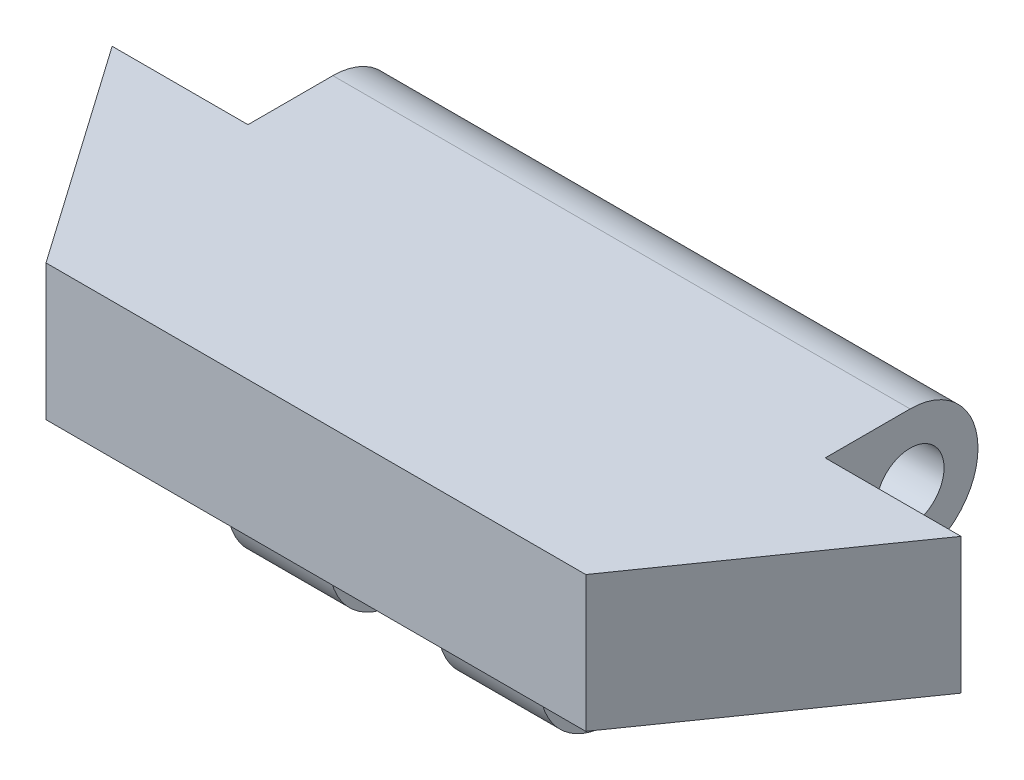
ISO-10303-21;
HEADER;
FILE_DESCRIPTION(('STEP AP214'),'2;1');
FILE_NAME('part.step','',(''),(''),'','','');
FILE_SCHEMA(('AUTOMOTIVE_DESIGN { 1 0 10303 214 1 1 1 1 }'));
ENDSEC;
DATA;
#1=APPLICATION_CONTEXT('core data for automotive mechanical design processes');
#2=APPLICATION_PROTOCOL_DEFINITION('international standard','automotive_design',2000,#1);
#3=PRODUCT_CONTEXT('',#1,'mechanical');
#4=PRODUCT('Part','Part','',(#3));
#5=PRODUCT_RELATED_PRODUCT_CATEGORY('part','',(#4));
#6=PRODUCT_DEFINITION_FORMATION('','',#4);
#7=PRODUCT_DEFINITION_CONTEXT('part definition',#1,'design');
#8=PRODUCT_DEFINITION('design','',#6,#7);
#9=PRODUCT_DEFINITION_SHAPE('','',#8);
#10=(LENGTH_UNIT() NAMED_UNIT(*) SI_UNIT(.MILLI.,.METRE.));
#11=(NAMED_UNIT(*) PLANE_ANGLE_UNIT() SI_UNIT($,.RADIAN.));
#12=(NAMED_UNIT(*) SI_UNIT($,.STERADIAN.) SOLID_ANGLE_UNIT());
#13=UNCERTAINTY_MEASURE_WITH_UNIT(LENGTH_MEASURE(1.E-05),#10,'distance_accuracy_value','');
#14=(GEOMETRIC_REPRESENTATION_CONTEXT(3) GLOBAL_UNCERTAINTY_ASSIGNED_CONTEXT((#13)) GLOBAL_UNIT_ASSIGNED_CONTEXT((#10,
#11,#12)) REPRESENTATION_CONTEXT('',''));
#15=CARTESIAN_POINT('',(0.,0.,0.));
#16=DIRECTION('',(0.,0.,1.));
#17=DIRECTION('',(1.,0.,0.));
#18=AXIS2_PLACEMENT_3D('',#15,#16,#17);
#19=CARTESIAN_POINT('',(0.,0.,0.));
#20=DIRECTION('',(0.,-1.,0.));
#21=DIRECTION('',(0.,0.,-1.));
#22=AXIS2_PLACEMENT_3D('',#19,#20,#21);
#23=PLANE('',#22);
#24=DIRECTION('',(1.,0.,0.));
#25=VECTOR('',#24,1.);
#26=CARTESIAN_POINT('',(7.9,0.,4.5));
#27=LINE('',#26,#25);
#28=CARTESIAN_POINT('',(7.9,0.,4.5));
#29=VERTEX_POINT('',#28);
#30=CARTESIAN_POINT('',(10.9,0.,4.5));
#31=VERTEX_POINT('',#30);
#32=EDGE_CURVE('E239',#29,#31,#27,.T.);
#33=ORIENTED_EDGE('',*,*,#32,.T.);
#34=DIRECTION('',(1.,0.,0.));
#35=VECTOR('',#34,1.);
#36=CARTESIAN_POINT('',(1.88612181134003,0.,4.5));
#37=LINE('',#36,#35);
#38=CARTESIAN_POINT('',(14.1,0.,4.5));
#39=VERTEX_POINT('',#38);
#40=EDGE_CURVE('E168',#31,#39,#37,.T.);
#41=ORIENTED_EDGE('',*,*,#40,.T.);
#42=CARTESIAN_POINT('',(17.1,0.,4.5));
#43=VERTEX_POINT('',#42);
#44=EDGE_CURVE('E243',#39,#43,#27,.T.);
#45=ORIENTED_EDGE('',*,*,#44,.T.);
#46=DIRECTION('',(0.,0.,1.));
#47=VECTOR('',#46,1.);
#48=CARTESIAN_POINT('',(17.1,0.,4.5));
#49=LINE('',#48,#47);
#50=CARTESIAN_POINT('',(17.1,0.,0.499999999999997));
#51=VERTEX_POINT('',#50);
#52=EDGE_CURVE('E221',#51,#43,#49,.T.);
#53=ORIENTED_EDGE('',*,*,#52,.F.);
#54=DIRECTION('',(1.,0.,0.));
#55=VECTOR('',#54,1.);
#56=CARTESIAN_POINT('',(7.9,0.,0.499999999999997));
#57=LINE('',#56,#55);
#58=CARTESIAN_POINT('',(14.1,0.,0.5));
#59=VERTEX_POINT('',#58);
#60=EDGE_CURVE('E247',#59,#51,#57,.T.);
#61=ORIENTED_EDGE('',*,*,#60,.F.);
#62=DIRECTION('',(0.,0.,1.));
#63=VECTOR('',#62,1.);
#64=CARTESIAN_POINT('',(14.1,0.,-2.5));
#65=LINE('',#64,#63);
#66=CARTESIAN_POINT('',(14.1,0.,-2.5));
#67=VERTEX_POINT('',#66);
#68=EDGE_CURVE('E186',#67,#59,#65,.T.);
#69=ORIENTED_EDGE('',*,*,#68,.F.);
#70=DIRECTION('',(-1.,0.,0.));
#71=VECTOR('',#70,1.);
#72=CARTESIAN_POINT('',(21.,0.,-2.5));
#73=LINE('',#72,#71);
#74=CARTESIAN_POINT('',(21.,0.,-2.5));
#75=VERTEX_POINT('',#74);
#76=EDGE_CURVE('E284',#75,#67,#73,.T.);
#77=ORIENTED_EDGE('',*,*,#76,.F.);
#78=DIRECTION('',(0.,0.,-1.));
#79=VECTOR('',#78,1.);
#80=CARTESIAN_POINT('',(21.,0.,0.));
#81=LINE('',#80,#79);
#82=CARTESIAN_POINT('',(21.,0.,0.));
#83=VERTEX_POINT('',#82);
#84=EDGE_CURVE('E264',#83,#75,#81,.T.);
#85=ORIENTED_EDGE('',*,*,#84,.F.);
#86=DIRECTION('',(-1.,0.,0.));
#87=VECTOR('',#86,1.);
#88=CARTESIAN_POINT('',(0.,0.,0.));
#89=LINE('',#88,#87);
#90=CARTESIAN_POINT('',(25.,0.,0.));
#91=VERTEX_POINT('',#90);
#92=EDGE_CURVE('E299',#91,#83,#89,.T.);
#93=ORIENTED_EDGE('',*,*,#92,.F.);
#94=DIRECTION('',(0.573576436351046,0.,-0.819152044288992));
#95=VECTOR('',#94,1.);
#96=CARTESIAN_POINT('',(25.,0.,0.));
#97=LINE('',#96,#95);
#98=CARTESIAN_POINT('',(20.4486510016369,0.,6.5));
#99=VERTEX_POINT('',#98);
#100=EDGE_CURVE('E305',#99,#91,#97,.T.);
#101=ORIENTED_EDGE('',*,*,#100,.F.);
#102=DIRECTION('',(1.,0.,0.));
#103=VECTOR('',#102,1.);
#104=CARTESIAN_POINT('',(4.55134899836309,0.,6.5));
#105=LINE('',#104,#103);
#106=CARTESIAN_POINT('',(4.55134899836309,0.,6.5));
#107=VERTEX_POINT('',#106);
#108=EDGE_CURVE('E303',#107,#99,#105,.T.);
#109=ORIENTED_EDGE('',*,*,#108,.F.);
#110=DIRECTION('',(0.573576436351044,0.,0.819152044288993));
#111=VECTOR('',#110,1.);
#112=CARTESIAN_POINT('',(0.,0.,0.));
#113=LINE('',#112,#111);
#114=CARTESIAN_POINT('',(0.,0.,0.));
#115=VERTEX_POINT('',#114);
#116=EDGE_CURVE('E301',#115,#107,#113,.T.);
#117=ORIENTED_EDGE('',*,*,#116,.F.);
#118=CARTESIAN_POINT('',(4.,0.,0.));
#119=VERTEX_POINT('',#118);
#120=EDGE_CURVE('E287',#119,#115,#89,.T.);
#121=ORIENTED_EDGE('',*,*,#120,.F.);
#122=DIRECTION('',(0.,0.,-1.));
#123=VECTOR('',#122,1.);
#124=CARTESIAN_POINT('',(4.,0.,0.));
#125=LINE('',#124,#123);
#126=CARTESIAN_POINT('',(4.,0.,-2.5));
#127=VERTEX_POINT('',#126);
#128=EDGE_CURVE('E274',#119,#127,#125,.T.);
#129=ORIENTED_EDGE('',*,*,#128,.T.);
#130=CARTESIAN_POINT('',(10.9,0.,-2.5));
#131=VERTEX_POINT('',#130);
#132=EDGE_CURVE('E283',#131,#127,#73,.T.);
#133=ORIENTED_EDGE('',*,*,#132,.F.);
#134=DIRECTION('',(0.,0.,1.));
#135=VECTOR('',#134,1.);
#136=CARTESIAN_POINT('',(10.9,0.,-2.5));
#137=LINE('',#136,#135);
#138=CARTESIAN_POINT('',(10.9,0.,0.5));
#139=VERTEX_POINT('',#138);
#140=EDGE_CURVE('E169',#131,#139,#137,.T.);
#141=ORIENTED_EDGE('',*,*,#140,.T.);
#142=CARTESIAN_POINT('',(7.9,0.,0.499999999999997));
#143=VERTEX_POINT('',#142);
#144=EDGE_CURVE('E244',#143,#139,#57,.T.);
#145=ORIENTED_EDGE('',*,*,#144,.F.);
#146=DIRECTION('',(0.,0.,1.));
#147=VECTOR('',#146,1.);
#148=CARTESIAN_POINT('',(7.9,0.,4.5));
#149=LINE('',#148,#147);
#150=EDGE_CURVE('E236',#143,#29,#149,.T.);
#151=ORIENTED_EDGE('',*,*,#150,.T.);
#152=EDGE_LOOP('',(#33,#41,#45,#53,#61,#69,#77,#85,#93,#101,#109,#117,#121,#129,#133,#141,#145,#151));
#153=FACE_BOUND('',#152,.T.);
#154=ADVANCED_FACE('F37',(#153),#23,.T.);
#155=CARTESIAN_POINT('',(7.9,0.,4.5));
#156=DIRECTION('',(0.,0.,1.));
#157=DIRECTION('',(1.,0.,0.));
#158=AXIS2_PLACEMENT_3D('',#155,#156,#157);
#159=PLANE('',#158);
#160=DIRECTION('',(0.,-1.,0.));
#161=VECTOR('',#160,1.);
#162=CARTESIAN_POINT('',(14.1,0.,4.5));
#163=LINE('',#162,#161);
#164=CARTESIAN_POINT('',(14.1,-1.5,4.5));
#165=VERTEX_POINT('',#164);
#166=EDGE_CURVE('E195',#39,#165,#163,.T.);
#167=ORIENTED_EDGE('',*,*,#166,.T.);
#168=DIRECTION('',(1.,0.,0.));
#169=VECTOR('',#168,1.);
#170=CARTESIAN_POINT('',(7.9,-1.5,4.5));
#171=LINE('',#170,#169);
#172=CARTESIAN_POINT('',(17.1,-1.5,4.5));
#173=VERTEX_POINT('',#172);
#174=EDGE_CURVE('E238',#165,#173,#171,.T.);
#175=ORIENTED_EDGE('',*,*,#174,.T.);
#176=DIRECTION('',(0.,-1.,0.));
#177=VECTOR('',#176,1.);
#178=CARTESIAN_POINT('',(17.1,0.,4.5));
#179=LINE('',#178,#177);
#180=EDGE_CURVE('E212',#43,#173,#179,.T.);
#181=ORIENTED_EDGE('',*,*,#180,.F.);
#182=ORIENTED_EDGE('',*,*,#44,.F.);
#183=EDGE_LOOP('',(#167,#175,#181,#182));
#184=FACE_BOUND('',#183,.T.);
#185=ADVANCED_FACE('F371',(#184),#159,.T.);
#186=CARTESIAN_POINT('',(7.9,0.,0.499999999999997));
#187=DIRECTION('',(0.,0.,-1.));
#188=DIRECTION('',(0.,1.,0.));
#189=AXIS2_PLACEMENT_3D('',#186,#187,#188);
#190=PLANE('',#189);
#191=DIRECTION('',(0.,1.,0.));
#192=VECTOR('',#191,1.);
#193=CARTESIAN_POINT('',(14.1,0.,0.499999999999997));
#194=LINE('',#193,#192);
#195=CARTESIAN_POINT('',(14.1,-1.5,0.499999999999998));
#196=VERTEX_POINT('',#195);
#197=EDGE_CURVE('E191',#196,#59,#194,.T.);
#198=ORIENTED_EDGE('',*,*,#197,.T.);
#199=ORIENTED_EDGE('',*,*,#60,.T.);
#200=DIRECTION('',(0.,1.,0.));
#201=VECTOR('',#200,1.);
#202=CARTESIAN_POINT('',(17.1,0.,0.499999999999997));
#203=LINE('',#202,#201);
#204=CARTESIAN_POINT('',(17.1,-1.5,0.499999999999998));
#205=VERTEX_POINT('',#204);
#206=EDGE_CURVE('E218',#205,#51,#203,.T.);
#207=ORIENTED_EDGE('',*,*,#206,.F.);
#208=DIRECTION('',(1.,0.,0.));
#209=VECTOR('',#208,1.);
#210=CARTESIAN_POINT('',(7.9,-1.5,0.499999999999998));
#211=LINE('',#210,#209);
#212=EDGE_CURVE('E251',#196,#205,#211,.T.);
#213=ORIENTED_EDGE('',*,*,#212,.F.);
#214=EDGE_LOOP('',(#198,#199,#207,#213));
#215=FACE_BOUND('',#214,.T.);
#216=ADVANCED_FACE('F363',(#215),#190,.T.);
#217=CARTESIAN_POINT('',(7.9,-1.5,2.5));
#218=DIRECTION('',(1.,0.,0.));
#219=DIRECTION('',(0.,0.,-1.));
#220=AXIS2_PLACEMENT_3D('',#217,#218,#219);
#221=CYLINDRICAL_SURFACE('',#220,2.);
#222=CARTESIAN_POINT('',(14.1,-1.5,2.5));
#223=DIRECTION('',(1.,0.,0.));
#224=DIRECTION('',(0.,1.,0.));
#225=AXIS2_PLACEMENT_3D('',#222,#223,#224);
#226=CIRCLE('',#225,2.);
#227=EDGE_CURVE('E198',#165,#196,#226,.T.);
#228=ORIENTED_EDGE('',*,*,#227,.T.);
#229=ORIENTED_EDGE('',*,*,#212,.T.);
#230=CARTESIAN_POINT('',(17.1,-1.5,2.5));
#231=DIRECTION('',(1.,0.,0.));
#232=DIRECTION('',(0.,0.,-1.));
#233=AXIS2_PLACEMENT_3D('',#230,#231,#232);
#234=CIRCLE('',#233,2.);
#235=EDGE_CURVE('E215',#173,#205,#234,.T.);
#236=ORIENTED_EDGE('',*,*,#235,.F.);
#237=ORIENTED_EDGE('',*,*,#174,.F.);
#238=EDGE_LOOP('',(#228,#229,#236,#237));
#239=FACE_BOUND('',#238,.T.);
#240=ADVANCED_FACE('F367',(#239),#221,.T.);
#241=CARTESIAN_POINT('',(7.9,-1.5,2.5));
#242=DIRECTION('',(1.,0.,0.));
#243=DIRECTION('',(0.,0.,-1.));
#244=AXIS2_PLACEMENT_3D('',#241,#242,#243);
#245=CYLINDRICAL_SURFACE('',#244,1.);
#246=CARTESIAN_POINT('',(14.1,-1.5,2.5));
#247=DIRECTION('',(1.,0.,0.));
#248=DIRECTION('',(0.,1.,0.));
#249=AXIS2_PLACEMENT_3D('',#246,#247,#248);
#250=CIRCLE('',#249,1.);
#251=CARTESIAN_POINT('',(14.1,-0.5,2.5));
#252=VERTEX_POINT('',#251);
#253=EDGE_CURVE('E199',#252,#252,#250,.T.);
#254=ORIENTED_EDGE('',*,*,#253,.F.);
#255=EDGE_LOOP('',(#254));
#256=FACE_BOUND('',#255,.T.);
#257=CARTESIAN_POINT('',(17.1,-1.5,2.5));
#258=DIRECTION('',(1.,0.,0.));
#259=DIRECTION('',(0.,0.,-1.));
#260=AXIS2_PLACEMENT_3D('',#257,#258,#259);
#261=CIRCLE('',#260,1.);
#262=CARTESIAN_POINT('',(17.1,-1.5,1.5));
#263=VERTEX_POINT('',#262);
#264=EDGE_CURVE('E202',#263,#263,#261,.T.);
#265=ORIENTED_EDGE('',*,*,#264,.T.);
#266=EDGE_LOOP('',(#265));
#267=FACE_BOUND('',#266,.T.);
#268=ADVANCED_FACE('F381',(#256,#267),#245,.F.);
#269=CARTESIAN_POINT('',(0.,4.,0.));
#270=DIRECTION('',(0.,0.,1.));
#271=DIRECTION('',(1.,0.,0.));
#272=AXIS2_PLACEMENT_3D('',#269,#270,#271);
#273=PLANE('',#272);
#274=DIRECTION('',(0.,-1.,0.));
#275=VECTOR('',#274,1.);
#276=CARTESIAN_POINT('',(21.,0.,0.));
#277=LINE('',#276,#275);
#278=CARTESIAN_POINT('',(21.,4.,0.));
#279=VERTEX_POINT('',#278);
#280=EDGE_CURVE('E261',#279,#83,#277,.T.);
#281=ORIENTED_EDGE('',*,*,#280,.F.);
#282=DIRECTION('',(-1.,0.,0.));
#283=VECTOR('',#282,1.);
#284=CARTESIAN_POINT('',(0.,4.,0.));
#285=LINE('',#284,#283);
#286=CARTESIAN_POINT('',(25.,4.,0.));
#287=VERTEX_POINT('',#286);
#288=EDGE_CURVE('E288',#287,#279,#285,.T.);
#289=ORIENTED_EDGE('',*,*,#288,.F.);
#290=DIRECTION('',(0.,-1.,0.));
#291=VECTOR('',#290,1.);
#292=CARTESIAN_POINT('',(25.,4.,0.));
#293=LINE('',#292,#291);
#294=EDGE_CURVE('E298',#287,#91,#293,.T.);
#295=ORIENTED_EDGE('',*,*,#294,.T.);
#296=ORIENTED_EDGE('',*,*,#92,.T.);
#297=EDGE_LOOP('',(#281,#289,#295,#296));
#298=FACE_BOUND('',#297,.T.);
#299=ADVANCED_FACE('F332',(#298),#273,.F.);
#300=CARTESIAN_POINT('',(4.,4.,0.));
#301=VERTEX_POINT('',#300);
#302=CARTESIAN_POINT('',(0.,4.,0.));
#303=VERTEX_POINT('',#302);
#304=EDGE_CURVE('E292',#301,#303,#285,.T.);
#305=ORIENTED_EDGE('',*,*,#304,.F.);
#306=DIRECTION('',(0.,-1.,0.));
#307=VECTOR('',#306,1.);
#308=CARTESIAN_POINT('',(4.,0.,0.));
#309=LINE('',#308,#307);
#310=EDGE_CURVE('E258',#301,#119,#309,.T.);
#311=ORIENTED_EDGE('',*,*,#310,.T.);
#312=ORIENTED_EDGE('',*,*,#120,.T.);
#313=DIRECTION('',(0.,-1.,0.));
#314=VECTOR('',#313,1.);
#315=CARTESIAN_POINT('',(0.,4.,0.));
#316=LINE('',#315,#314);
#317=EDGE_CURVE('E11',#303,#115,#316,.T.);
#318=ORIENTED_EDGE('',*,*,#317,.F.);
#319=EDGE_LOOP('',(#305,#311,#312,#318));
#320=FACE_BOUND('',#319,.T.);
#321=ADVANCED_FACE('F39',(#320),#273,.F.);
#322=CARTESIAN_POINT('',(0.,4.,0.));
#323=DIRECTION('',(0.819152044288993,0.,-0.573576436351044));
#324=DIRECTION('',(-0.573576436351044,0.,-0.819152044288993));
#325=AXIS2_PLACEMENT_3D('',#322,#323,#324);
#326=PLANE('',#325);
#327=ORIENTED_EDGE('',*,*,#116,.T.);
#328=DIRECTION('',(0.,-1.,0.));
#329=VECTOR('',#328,1.);
#330=CARTESIAN_POINT('',(4.55134899836309,4.,6.5));
#331=LINE('',#330,#329);
#332=CARTESIAN_POINT('',(4.55134899836309,4.,6.5));
#333=VERTEX_POINT('',#332);
#334=EDGE_CURVE('E45',#333,#107,#331,.T.);
#335=ORIENTED_EDGE('',*,*,#334,.F.);
#336=DIRECTION('',(0.573576436351044,0.,0.819152044288993));
#337=VECTOR('',#336,1.);
#338=CARTESIAN_POINT('',(0.,4.,0.));
#339=LINE('',#338,#337);
#340=EDGE_CURVE('E291',#303,#333,#339,.T.);
#341=ORIENTED_EDGE('',*,*,#340,.F.);
#342=ORIENTED_EDGE('',*,*,#317,.T.);
#343=EDGE_LOOP('',(#327,#335,#341,#342));
#344=FACE_BOUND('',#343,.T.);
#345=ADVANCED_FACE('F410',(#344),#326,.F.);
#346=CARTESIAN_POINT('',(4.55134899836309,4.,6.5));
#347=DIRECTION('',(0.,0.,-1.));
#348=DIRECTION('',(-1.,0.,0.));
#349=AXIS2_PLACEMENT_3D('',#346,#347,#348);
#350=PLANE('',#349);
#351=ORIENTED_EDGE('',*,*,#108,.T.);
#352=DIRECTION('',(0.,-1.,0.));
#353=VECTOR('',#352,1.);
#354=CARTESIAN_POINT('',(20.4486510016369,4.,6.5));
#355=LINE('',#354,#353);
#356=CARTESIAN_POINT('',(20.4486510016369,4.,6.5));
#357=VERTEX_POINT('',#356);
#358=EDGE_CURVE('E309',#357,#99,#355,.T.);
#359=ORIENTED_EDGE('',*,*,#358,.F.);
#360=DIRECTION('',(1.,0.,0.));
#361=VECTOR('',#360,1.);
#362=CARTESIAN_POINT('',(4.55134899836309,4.,6.5));
#363=LINE('',#362,#361);
#364=EDGE_CURVE('E294',#333,#357,#363,.T.);
#365=ORIENTED_EDGE('',*,*,#364,.F.);
#366=ORIENTED_EDGE('',*,*,#334,.T.);
#367=EDGE_LOOP('',(#351,#359,#365,#366));
#368=FACE_BOUND('',#367,.T.);
#369=ADVANCED_FACE('F316',(#368),#350,.F.);
#370=CARTESIAN_POINT('',(25.,4.,0.));
#371=DIRECTION('',(-0.819152044288992,0.,-0.573576436351046));
#372=DIRECTION('',(-0.573576436351046,0.,0.819152044288992));
#373=AXIS2_PLACEMENT_3D('',#370,#371,#372);
#374=PLANE('',#373);
#375=ORIENTED_EDGE('',*,*,#100,.T.);
#376=ORIENTED_EDGE('',*,*,#294,.F.);
#377=DIRECTION('',(0.573576436351046,0.,-0.819152044288992));
#378=VECTOR('',#377,1.);
#379=CARTESIAN_POINT('',(25.,4.,0.));
#380=LINE('',#379,#378);
#381=EDGE_CURVE('E296',#357,#287,#380,.T.);
#382=ORIENTED_EDGE('',*,*,#381,.F.);
#383=ORIENTED_EDGE('',*,*,#358,.T.);
#384=EDGE_LOOP('',(#375,#376,#382,#383));
#385=FACE_BOUND('',#384,.T.);
#386=ADVANCED_FACE('F328',(#385),#374,.F.);
#387=CARTESIAN_POINT('',(0.,4.,0.));
#388=DIRECTION('',(0.,-1.,0.));
#389=DIRECTION('',(0.,0.,-1.));
#390=AXIS2_PLACEMENT_3D('',#387,#388,#389);
#391=PLANE('',#390);
#392=ORIENTED_EDGE('',*,*,#288,.T.);
#393=DIRECTION('',(0.,0.,1.));
#394=VECTOR('',#393,1.);
#395=CARTESIAN_POINT('',(21.,4.,0.));
#396=LINE('',#395,#394);
#397=CARTESIAN_POINT('',(21.,4.,-2.5));
#398=VERTEX_POINT('',#397);
#399=EDGE_CURVE('E269',#398,#279,#396,.T.);
#400=ORIENTED_EDGE('',*,*,#399,.F.);
#401=DIRECTION('',(-1.,0.,0.));
#402=VECTOR('',#401,1.);
#403=CARTESIAN_POINT('',(21.,4.,-2.5));
#404=LINE('',#403,#402);
#405=CARTESIAN_POINT('',(4.,4.,-2.5));
#406=VERTEX_POINT('',#405);
#407=EDGE_CURVE('E272',#398,#406,#404,.T.);
#408=ORIENTED_EDGE('',*,*,#407,.T.);
#409=DIRECTION('',(0.,0.,1.));
#410=VECTOR('',#409,1.);
#411=CARTESIAN_POINT('',(4.,4.,0.));
#412=LINE('',#411,#410);
#413=EDGE_CURVE('E265',#406,#301,#412,.T.);
#414=ORIENTED_EDGE('',*,*,#413,.T.);
#415=ORIENTED_EDGE('',*,*,#304,.T.);
#416=ORIENTED_EDGE('',*,*,#340,.T.);
#417=ORIENTED_EDGE('',*,*,#364,.T.);
#418=ORIENTED_EDGE('',*,*,#381,.T.);
#419=EDGE_LOOP('',(#392,#400,#408,#414,#415,#416,#417,#418));
#420=FACE_BOUND('',#419,.T.);
#421=ADVANCED_FACE('F335',(#420),#391,.F.);
#422=CARTESIAN_POINT('',(21.,2.,-2.5));
#423=DIRECTION('',(1.,0.,0.));
#424=DIRECTION('',(0.,0.,-1.));
#425=AXIS2_PLACEMENT_3D('',#422,#423,#424);
#426=PLANE('',#425);
#427=ORIENTED_EDGE('',*,*,#280,.T.);
#428=ORIENTED_EDGE('',*,*,#84,.T.);
#429=CARTESIAN_POINT('',(21.,2.,-2.5));
#430=DIRECTION('',(1.,0.,0.));
#431=DIRECTION('',(0.,0.,-1.));
#432=AXIS2_PLACEMENT_3D('',#429,#430,#431);
#433=CIRCLE('',#432,2.);
#434=EDGE_CURVE('E267',#75,#398,#433,.T.);
#435=ORIENTED_EDGE('',*,*,#434,.T.);
#436=ORIENTED_EDGE('',*,*,#399,.T.);
#437=EDGE_LOOP('',(#427,#428,#435,#436));
#438=FACE_BOUND('',#437,.T.);
#439=CARTESIAN_POINT('',(21.,2.,-2.5));
#440=DIRECTION('',(1.,0.,0.));
#441=DIRECTION('',(0.,0.,-1.));
#442=AXIS2_PLACEMENT_3D('',#439,#440,#441);
#443=CIRCLE('',#442,1.);
#444=CARTESIAN_POINT('',(21.,2.,-3.5));
#445=VERTEX_POINT('',#444);
#446=EDGE_CURVE('E255',#445,#445,#443,.T.);
#447=ORIENTED_EDGE('',*,*,#446,.F.);
#448=EDGE_LOOP('',(#447));
#449=FACE_BOUND('',#448,.T.);
#450=ADVANCED_FACE('F337',(#438,#449),#426,.T.);
#451=CARTESIAN_POINT('',(4.,2.,-2.5));
#452=DIRECTION('',(1.,0.,0.));
#453=DIRECTION('',(0.,0.,-1.));
#454=AXIS2_PLACEMENT_3D('',#451,#452,#453);
#455=PLANE('',#454);
#456=ORIENTED_EDGE('',*,*,#310,.F.);
#457=ORIENTED_EDGE('',*,*,#413,.F.);
#458=CARTESIAN_POINT('',(4.,2.,-2.5));
#459=DIRECTION('',(1.,0.,0.));
#460=DIRECTION('',(0.,0.,-1.));
#461=AXIS2_PLACEMENT_3D('',#458,#459,#460);
#462=CIRCLE('',#461,2.);
#463=EDGE_CURVE('E277',#127,#406,#462,.T.);
#464=ORIENTED_EDGE('',*,*,#463,.F.);
#465=ORIENTED_EDGE('',*,*,#128,.F.);
#466=EDGE_LOOP('',(#456,#457,#464,#465));
#467=FACE_BOUND('',#466,.T.);
#468=CARTESIAN_POINT('',(4.,2.,-2.5));
#469=DIRECTION('',(1.,0.,0.));
#470=DIRECTION('',(0.,0.,-1.));
#471=AXIS2_PLACEMENT_3D('',#468,#469,#470);
#472=CIRCLE('',#471,1.);
#473=CARTESIAN_POINT('',(4.,2.,-3.5));
#474=VERTEX_POINT('',#473);
#475=EDGE_CURVE('E242',#474,#474,#472,.T.);
#476=ORIENTED_EDGE('',*,*,#475,.T.);
#477=EDGE_LOOP('',(#476));
#478=FACE_BOUND('',#477,.T.);
#479=ADVANCED_FACE('F348',(#467,#478),#455,.F.);
#480=CARTESIAN_POINT('',(21.,2.,-2.5));
#481=DIRECTION('',(-1.,0.,0.));
#482=DIRECTION('',(0.,0.,1.));
#483=AXIS2_PLACEMENT_3D('',#480,#481,#482);
#484=CYLINDRICAL_SURFACE('',#483,2.);
#485=ORIENTED_EDGE('',*,*,#463,.T.);
#486=ORIENTED_EDGE('',*,*,#407,.F.);
#487=ORIENTED_EDGE('',*,*,#434,.F.);
#488=ORIENTED_EDGE('',*,*,#76,.T.);
#489=DIRECTION('',(1.,0.,0.));
#490=VECTOR('',#489,1.);
#491=CARTESIAN_POINT('',(1.88612181134003,0.,-2.5));
#492=LINE('',#491,#490);
#493=EDGE_CURVE('E180',#131,#67,#492,.T.);
#494=ORIENTED_EDGE('',*,*,#493,.F.);
#495=ORIENTED_EDGE('',*,*,#132,.T.);
#496=EDGE_LOOP('',(#485,#486,#487,#488,#494,#495));
#497=FACE_BOUND('',#496,.T.);
#498=ADVANCED_FACE('F343',(#497),#484,.T.);
#499=CARTESIAN_POINT('',(21.,2.,-2.5));
#500=DIRECTION('',(-1.,0.,0.));
#501=DIRECTION('',(0.,0.,1.));
#502=AXIS2_PLACEMENT_3D('',#499,#500,#501);
#503=CYLINDRICAL_SURFACE('',#502,1.);
#504=ORIENTED_EDGE('',*,*,#446,.T.);
#505=EDGE_LOOP('',(#504));
#506=FACE_BOUND('',#505,.T.);
#507=ORIENTED_EDGE('',*,*,#475,.F.);
#508=EDGE_LOOP('',(#507));
#509=FACE_BOUND('',#508,.T.);
#510=ADVANCED_FACE('F441',(#506,#509),#503,.F.);
#511=DIRECTION('',(0.,1.,0.));
#512=VECTOR('',#511,1.);
#513=CARTESIAN_POINT('',(10.9,0.,4.5));
#514=LINE('',#513,#512);
#515=CARTESIAN_POINT('',(10.9,-1.5,4.5));
#516=VERTEX_POINT('',#515);
#517=EDGE_CURVE('E60',#516,#31,#514,.T.);
#518=ORIENTED_EDGE('',*,*,#517,.T.);
#519=ORIENTED_EDGE('',*,*,#32,.F.);
#520=DIRECTION('',(0.,-1.,0.));
#521=VECTOR('',#520,1.);
#522=CARTESIAN_POINT('',(7.9,0.,4.5));
#523=LINE('',#522,#521);
#524=CARTESIAN_POINT('',(7.9,-1.5,4.5));
#525=VERTEX_POINT('',#524);
#526=EDGE_CURVE('E227',#29,#525,#523,.T.);
#527=ORIENTED_EDGE('',*,*,#526,.T.);
#528=EDGE_CURVE('E252',#525,#516,#171,.T.);
#529=ORIENTED_EDGE('',*,*,#528,.T.);
#530=EDGE_LOOP('',(#518,#519,#527,#529));
#531=FACE_BOUND('',#530,.T.);
#532=ADVANCED_FACE('F403',(#531),#159,.T.);
#533=DIRECTION('',(0.,-1.,0.));
#534=VECTOR('',#533,1.);
#535=CARTESIAN_POINT('',(10.9,0.,0.499999999999997));
#536=LINE('',#535,#534);
#537=CARTESIAN_POINT('',(10.9,-1.5,0.499999999999998));
#538=VERTEX_POINT('',#537);
#539=EDGE_CURVE('E188',#139,#538,#536,.T.);
#540=ORIENTED_EDGE('',*,*,#539,.T.);
#541=CARTESIAN_POINT('',(7.9,-1.5,0.499999999999998));
#542=VERTEX_POINT('',#541);
#543=EDGE_CURVE('E248',#542,#538,#211,.T.);
#544=ORIENTED_EDGE('',*,*,#543,.F.);
#545=DIRECTION('',(0.,1.,0.));
#546=VECTOR('',#545,1.);
#547=CARTESIAN_POINT('',(7.9,0.,0.499999999999997));
#548=LINE('',#547,#546);
#549=EDGE_CURVE('E233',#542,#143,#548,.T.);
#550=ORIENTED_EDGE('',*,*,#549,.T.);
#551=ORIENTED_EDGE('',*,*,#144,.T.);
#552=EDGE_LOOP('',(#540,#544,#550,#551));
#553=FACE_BOUND('',#552,.T.);
#554=ADVANCED_FACE('F473',(#553),#190,.T.);
#555=CARTESIAN_POINT('',(10.9,-1.5,2.5));
#556=DIRECTION('',(-1.,0.,0.));
#557=DIRECTION('',(0.,-1.,0.));
#558=AXIS2_PLACEMENT_3D('',#555,#556,#557);
#559=CIRCLE('',#558,2.);
#560=EDGE_CURVE('E203',#538,#516,#559,.T.);
#561=ORIENTED_EDGE('',*,*,#560,.T.);
#562=ORIENTED_EDGE('',*,*,#528,.F.);
#563=CARTESIAN_POINT('',(7.9,-1.5,2.5));
#564=DIRECTION('',(1.,0.,0.));
#565=DIRECTION('',(0.,0.,-1.));
#566=AXIS2_PLACEMENT_3D('',#563,#564,#565);
#567=CIRCLE('',#566,2.);
#568=EDGE_CURVE('E230',#525,#542,#567,.T.);
#569=ORIENTED_EDGE('',*,*,#568,.T.);
#570=ORIENTED_EDGE('',*,*,#543,.T.);
#571=EDGE_LOOP('',(#561,#562,#569,#570));
#572=FACE_BOUND('',#571,.T.);
#573=ADVANCED_FACE('F391',(#572),#221,.T.);
#574=CARTESIAN_POINT('',(7.9,-1.5,2.5));
#575=DIRECTION('',(1.,0.,0.));
#576=DIRECTION('',(0.,0.,-1.));
#577=AXIS2_PLACEMENT_3D('',#574,#575,#576);
#578=PLANE('',#577);
#579=CARTESIAN_POINT('',(7.9,-1.5,2.5));
#580=DIRECTION('',(1.,0.,0.));
#581=DIRECTION('',(0.,0.,-1.));
#582=AXIS2_PLACEMENT_3D('',#579,#580,#581);
#583=CIRCLE('',#582,1.);
#584=CARTESIAN_POINT('',(7.9,-1.5,1.5));
#585=VERTEX_POINT('',#584);
#586=EDGE_CURVE('E224',#585,#585,#583,.T.);
#587=ORIENTED_EDGE('',*,*,#586,.T.);
#588=EDGE_LOOP('',(#587));
#589=FACE_BOUND('',#588,.T.);
#590=ORIENTED_EDGE('',*,*,#526,.F.);
#591=ORIENTED_EDGE('',*,*,#150,.F.);
#592=ORIENTED_EDGE('',*,*,#549,.F.);
#593=ORIENTED_EDGE('',*,*,#568,.F.);
#594=EDGE_LOOP('',(#590,#591,#592,#593));
#595=FACE_BOUND('',#594,.T.);
#596=ADVANCED_FACE('F395',(#589,#595),#578,.F.);
#597=CARTESIAN_POINT('',(10.9,-1.5,2.5));
#598=DIRECTION('',(-1.,0.,0.));
#599=DIRECTION('',(0.,-1.,0.));
#600=AXIS2_PLACEMENT_3D('',#597,#598,#599);
#601=CIRCLE('',#600,1.);
#602=CARTESIAN_POINT('',(10.9,-2.5,2.5));
#603=VERTEX_POINT('',#602);
#604=EDGE_CURVE('E206',#603,#603,#601,.T.);
#605=ORIENTED_EDGE('',*,*,#604,.F.);
#606=EDGE_LOOP('',(#605));
#607=FACE_BOUND('',#606,.T.);
#608=ORIENTED_EDGE('',*,*,#586,.F.);
#609=EDGE_LOOP('',(#608));
#610=FACE_BOUND('',#609,.T.);
#611=ADVANCED_FACE('F377',(#607,#610),#245,.F.);
#612=CARTESIAN_POINT('',(17.1,-1.5,2.5));
#613=DIRECTION('',(1.,0.,0.));
#614=DIRECTION('',(0.,0.,-1.));
#615=AXIS2_PLACEMENT_3D('',#612,#613,#614);
#616=PLANE('',#615);
#617=ORIENTED_EDGE('',*,*,#180,.T.);
#618=ORIENTED_EDGE('',*,*,#235,.T.);
#619=ORIENTED_EDGE('',*,*,#206,.T.);
#620=ORIENTED_EDGE('',*,*,#52,.T.);
#621=EDGE_LOOP('',(#617,#618,#619,#620));
#622=FACE_BOUND('',#621,.T.);
#623=ORIENTED_EDGE('',*,*,#264,.F.);
#624=EDGE_LOOP('',(#623));
#625=FACE_BOUND('',#624,.T.);
#626=ADVANCED_FACE('F374',(#622,#625),#616,.T.);
#627=CARTESIAN_POINT('',(14.1,0.,-4.501));
#628=DIRECTION('',(1.,0.,0.));
#629=DIRECTION('',(0.,1.,0.));
#630=AXIS2_PLACEMENT_3D('',#627,#628,#629);
#631=PLANE('',#630);
#632=ORIENTED_EDGE('',*,*,#253,.T.);
#633=EDGE_LOOP('',(#632));
#634=FACE_BOUND('',#633,.T.);
#635=ORIENTED_EDGE('',*,*,#166,.F.);
#636=CARTESIAN_POINT('',(14.1,-1.5,2.5));
#637=DIRECTION('',(-1.,0.,0.));
#638=DIRECTION('',(0.,-1.,0.));
#639=AXIS2_PLACEMENT_3D('',#636,#637,#638);
#640=CIRCLE('',#639,2.5);
#641=CARTESIAN_POINT('',(14.1,0.946135639888003,1.9838406919664));
#642=VERTEX_POINT('',#641);
#643=EDGE_CURVE('E178',#39,#642,#640,.T.);
#644=ORIENTED_EDGE('',*,*,#643,.T.);
#645=DIRECTION('',(0.,-0.206463723213439,-0.9784542559552));
#646=VECTOR('',#645,1.);
#647=CARTESIAN_POINT('',(14.1,0.946135639888003,1.9838406919664));
#648=LINE('',#647,#646);
#649=EDGE_CURVE('E177',#642,#67,#648,.T.);
#650=ORIENTED_EDGE('',*,*,#649,.T.);
#651=ORIENTED_EDGE('',*,*,#68,.T.);
#652=ORIENTED_EDGE('',*,*,#197,.F.);
#653=ORIENTED_EDGE('',*,*,#227,.F.);
#654=EDGE_LOOP('',(#635,#644,#650,#651,#652,#653));
#655=FACE_BOUND('',#654,.T.);
#656=ADVANCED_FACE('F357',(#634,#655),#631,.F.);
#657=CARTESIAN_POINT('',(10.9,0.,-4.501));
#658=DIRECTION('',(-1.,0.,0.));
#659=DIRECTION('',(0.,-1.,0.));
#660=AXIS2_PLACEMENT_3D('',#657,#658,#659);
#661=PLANE('',#660);
#662=ORIENTED_EDGE('',*,*,#604,.T.);
#663=EDGE_LOOP('',(#662));
#664=FACE_BOUND('',#663,.T.);
#665=ORIENTED_EDGE('',*,*,#560,.F.);
#666=ORIENTED_EDGE('',*,*,#539,.F.);
#667=ORIENTED_EDGE('',*,*,#140,.F.);
#668=DIRECTION('',(0.,-0.206463723213439,-0.9784542559552));
#669=VECTOR('',#668,1.);
#670=CARTESIAN_POINT('',(10.9,0.946135639888001,1.9838406919664));
#671=LINE('',#670,#669);
#672=CARTESIAN_POINT('',(10.9,0.946135639888001,1.9838406919664));
#673=VERTEX_POINT('',#672);
#674=EDGE_CURVE('E52',#673,#131,#671,.T.);
#675=ORIENTED_EDGE('',*,*,#674,.F.);
#676=CARTESIAN_POINT('',(10.9,-1.5,2.5));
#677=DIRECTION('',(-1.,0.,0.));
#678=DIRECTION('',(0.,-1.,0.));
#679=AXIS2_PLACEMENT_3D('',#676,#677,#678);
#680=CIRCLE('',#679,2.5);
#681=EDGE_CURVE('E163',#31,#673,#680,.T.);
#682=ORIENTED_EDGE('',*,*,#681,.F.);
#683=ORIENTED_EDGE('',*,*,#517,.F.);
#684=EDGE_LOOP('',(#665,#666,#667,#675,#682,#683));
#685=FACE_BOUND('',#684,.T.);
#686=ADVANCED_FACE('F171',(#664,#685),#661,.F.);
#687=CARTESIAN_POINT('',(1.88612181134003,-1.5,2.5));
#688=DIRECTION('',(1.,0.,0.));
#689=DIRECTION('',(0.,1.,0.));
#690=AXIS2_PLACEMENT_3D('',#687,#688,#689);
#691=CYLINDRICAL_SURFACE('',#690,2.5);
#692=ORIENTED_EDGE('',*,*,#681,.T.);
#693=DIRECTION('',(1.,0.,0.));
#694=VECTOR('',#693,1.);
#695=CARTESIAN_POINT('',(1.88612181134003,0.946135639887997,1.9838406919664));
#696=LINE('',#695,#694);
#697=EDGE_CURVE('E165',#673,#642,#696,.T.);
#698=ORIENTED_EDGE('',*,*,#697,.T.);
#699=ORIENTED_EDGE('',*,*,#643,.F.);
#700=ORIENTED_EDGE('',*,*,#40,.F.);
#701=EDGE_LOOP('',(#692,#698,#699,#700));
#702=FACE_BOUND('',#701,.T.);
#703=ADVANCED_FACE('F164',(#702),#691,.F.);
#704=CARTESIAN_POINT('',(1.88612181134003,0.946135639887997,1.9838406919664));
#705=DIRECTION('',(0.,-0.9784542559552,0.206463723213439));
#706=DIRECTION('',(0.,-0.206463723213439,-0.9784542559552));
#707=AXIS2_PLACEMENT_3D('',#704,#705,#706);
#708=PLANE('',#707);
#709=ORIENTED_EDGE('',*,*,#674,.T.);
#710=ORIENTED_EDGE('',*,*,#493,.T.);
#711=ORIENTED_EDGE('',*,*,#649,.F.);
#712=ORIENTED_EDGE('',*,*,#697,.F.);
#713=EDGE_LOOP('',(#709,#710,#711,#712));
#714=FACE_BOUND('',#713,.T.);
#715=ADVANCED_FACE('F175',(#714),#708,.T.);
#716=CLOSED_SHELL('',(#154,#185,#216,#240,#268,#299,#321,#345,#369,#386,#421,#450,#479,#498,
#510,#532,#554,#573,#596,#611,#626,#656,#686,#703,#715));
#717=MANIFOLD_SOLID_BREP('B2',#716);
#718=ADVANCED_BREP_SHAPE_REPRESENTATION('',(#18,#717),#14);
#719=SHAPE_DEFINITION_REPRESENTATION(#9,#718);
ENDSEC;
END-ISO-10303-21;
